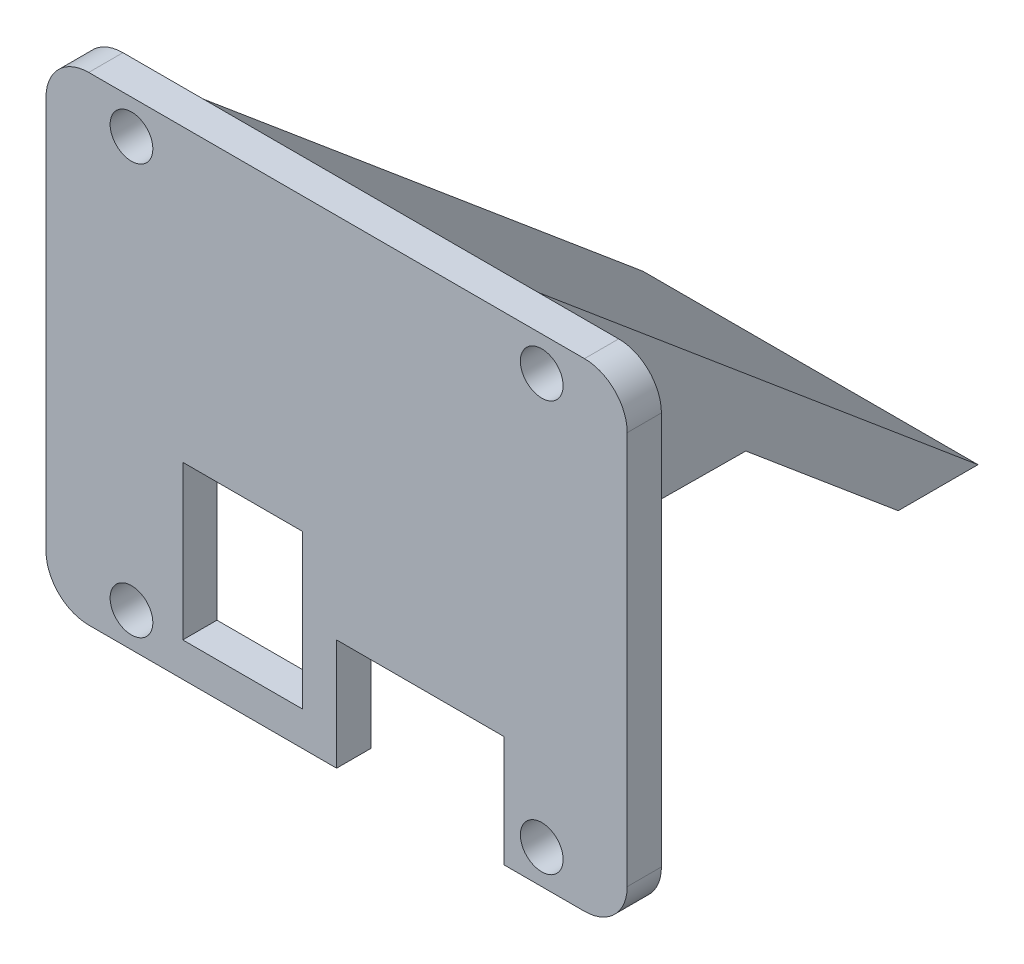
ISO-10303-21;
HEADER;
FILE_DESCRIPTION(('STEP AP214'),'2;1');
FILE_NAME('part.step','',(''),(''),'','','');
FILE_SCHEMA(('AUTOMOTIVE_DESIGN { 1 0 10303 214 1 1 1 1 }'));
ENDSEC;
DATA;
#1=APPLICATION_CONTEXT('core data for automotive mechanical design processes');
#2=APPLICATION_PROTOCOL_DEFINITION('international standard','automotive_design',2000,#1);
#3=PRODUCT_CONTEXT('',#1,'mechanical');
#4=PRODUCT('Part','Part','',(#3));
#5=PRODUCT_RELATED_PRODUCT_CATEGORY('part','',(#4));
#6=PRODUCT_DEFINITION_FORMATION('','',#4);
#7=PRODUCT_DEFINITION_CONTEXT('part definition',#1,'design');
#8=PRODUCT_DEFINITION('design','',#6,#7);
#9=PRODUCT_DEFINITION_SHAPE('','',#8);
#10=(LENGTH_UNIT() NAMED_UNIT(*) SI_UNIT(.MILLI.,.METRE.));
#11=(NAMED_UNIT(*) PLANE_ANGLE_UNIT() SI_UNIT($,.RADIAN.));
#12=(NAMED_UNIT(*) SI_UNIT($,.STERADIAN.) SOLID_ANGLE_UNIT());
#13=UNCERTAINTY_MEASURE_WITH_UNIT(LENGTH_MEASURE(1.E-05),#10,'distance_accuracy_value','');
#14=(GEOMETRIC_REPRESENTATION_CONTEXT(3) GLOBAL_UNCERTAINTY_ASSIGNED_CONTEXT((#13)) GLOBAL_UNIT_ASSIGNED_CONTEXT((#10,
#11,#12)) REPRESENTATION_CONTEXT('',''));
#15=CARTESIAN_POINT('',(0.,0.,0.));
#16=DIRECTION('',(0.,0.,1.));
#17=DIRECTION('',(1.,0.,0.));
#18=AXIS2_PLACEMENT_3D('',#15,#16,#17);
#19=CARTESIAN_POINT('',(9.8,-14.,0.));
#20=DIRECTION('',(1.,0.,0.));
#21=DIRECTION('',(0.,0.,-1.));
#22=AXIS2_PLACEMENT_3D('',#19,#20,#21);
#23=PLANE('',#22);
#24=DIRECTION('',(0.,-1.,0.));
#25=VECTOR('',#24,1.);
#26=CARTESIAN_POINT('',(9.8,-14.,2.));
#27=LINE('',#26,#25);
#28=CARTESIAN_POINT('',(9.8,-7.5,2.));
#29=VERTEX_POINT('',#28);
#30=CARTESIAN_POINT('',(9.8,-14.,2.));
#31=VERTEX_POINT('',#30);
#32=EDGE_CURVE('E283',#29,#31,#27,.T.);
#33=ORIENTED_EDGE('',*,*,#32,.F.);
#34=DIRECTION('',(0.,0.,1.));
#35=VECTOR('',#34,1.);
#36=CARTESIAN_POINT('',(9.8,-7.5,-8.5));
#37=LINE('',#36,#35);
#38=CARTESIAN_POINT('',(9.8,-7.5,0.));
#39=VERTEX_POINT('',#38);
#40=EDGE_CURVE('E324',#39,#29,#37,.T.);
#41=ORIENTED_EDGE('',*,*,#40,.F.);
#42=DIRECTION('',(0.,1.,0.));
#43=VECTOR('',#42,1.);
#44=CARTESIAN_POINT('',(9.8,-14.,0.));
#45=LINE('',#44,#43);
#46=CARTESIAN_POINT('',(9.8,-14.,0.));
#47=VERTEX_POINT('',#46);
#48=EDGE_CURVE('E402',#47,#39,#45,.T.);
#49=ORIENTED_EDGE('',*,*,#48,.F.);
#50=DIRECTION('',(0.,0.,1.));
#51=VECTOR('',#50,1.);
#52=CARTESIAN_POINT('',(9.8,-14.,0.));
#53=LINE('',#52,#51);
#54=EDGE_CURVE('E405',#47,#31,#53,.T.);
#55=ORIENTED_EDGE('',*,*,#54,.T.);
#56=EDGE_LOOP('',(#33,#41,#49,#55));
#57=FACE_BOUND('',#56,.T.);
#58=ADVANCED_FACE('F103',(#57),#23,.F.);
#59=CARTESIAN_POINT('',(0.,-14.,0.));
#60=DIRECTION('',(-1.,0.,0.));
#61=DIRECTION('',(0.,0.,1.));
#62=AXIS2_PLACEMENT_3D('',#59,#60,#61);
#63=PLANE('',#62);
#64=DIRECTION('',(0.,1.,0.));
#65=VECTOR('',#64,1.);
#66=CARTESIAN_POINT('',(0.,-14.,2.));
#67=LINE('',#66,#65);
#68=CARTESIAN_POINT('',(0.,-14.,2.));
#69=VERTEX_POINT('',#68);
#70=CARTESIAN_POINT('',(0.,-7.5,2.));
#71=VERTEX_POINT('',#70);
#72=EDGE_CURVE('E278',#69,#71,#67,.T.);
#73=ORIENTED_EDGE('',*,*,#72,.F.);
#74=DIRECTION('',(0.,0.,1.));
#75=VECTOR('',#74,1.);
#76=CARTESIAN_POINT('',(0.,-14.,0.));
#77=LINE('',#76,#75);
#78=CARTESIAN_POINT('',(0.,-14.,0.));
#79=VERTEX_POINT('',#78);
#80=EDGE_CURVE('E404',#79,#69,#77,.T.);
#81=ORIENTED_EDGE('',*,*,#80,.F.);
#82=DIRECTION('',(0.,-1.,0.));
#83=VECTOR('',#82,1.);
#84=CARTESIAN_POINT('',(0.,-14.,0.));
#85=LINE('',#84,#83);
#86=CARTESIAN_POINT('',(0.,-7.5,0.));
#87=VERTEX_POINT('',#86);
#88=EDGE_CURVE('E399',#87,#79,#85,.T.);
#89=ORIENTED_EDGE('',*,*,#88,.F.);
#90=DIRECTION('',(0.,0.,1.));
#91=VECTOR('',#90,1.);
#92=CARTESIAN_POINT('',(0.,-7.5,-8.5));
#93=LINE('',#92,#91);
#94=EDGE_CURVE('E325',#87,#71,#93,.T.);
#95=ORIENTED_EDGE('',*,*,#94,.T.);
#96=EDGE_LOOP('',(#73,#81,#89,#95));
#97=FACE_BOUND('',#96,.T.);
#98=ADVANCED_FACE('F472',(#97),#63,.F.);
#99=CARTESIAN_POINT('',(-17.,-14.,0.));
#100=DIRECTION('',(0.,-1.,0.));
#101=DIRECTION('',(0.,0.,-1.));
#102=AXIS2_PLACEMENT_3D('',#99,#100,#101);
#103=PLANE('',#102);
#104=ORIENTED_EDGE('',*,*,#80,.T.);
#105=DIRECTION('',(-1.,0.,0.));
#106=VECTOR('',#105,1.);
#107=CARTESIAN_POINT('',(-17.,-14.,2.));
#108=LINE('',#107,#106);
#109=CARTESIAN_POINT('',(-14.5,-14.,2.));
#110=VERTEX_POINT('',#109);
#111=EDGE_CURVE('E288',#69,#110,#108,.T.);
#112=ORIENTED_EDGE('',*,*,#111,.T.);
#113=DIRECTION('',(0.,0.,1.));
#114=VECTOR('',#113,1.);
#115=CARTESIAN_POINT('',(-14.5,-14.,0.));
#116=LINE('',#115,#114);
#117=CARTESIAN_POINT('',(-14.5,-14.,0.));
#118=VERTEX_POINT('',#117);
#119=EDGE_CURVE('E415',#110,#118,#116,.F.);
#120=ORIENTED_EDGE('',*,*,#119,.T.);
#121=DIRECTION('',(1.,0.,0.));
#122=VECTOR('',#121,1.);
#123=CARTESIAN_POINT('',(-17.,-14.,0.));
#124=LINE('',#123,#122);
#125=EDGE_CURVE('E397',#118,#79,#124,.T.);
#126=ORIENTED_EDGE('',*,*,#125,.T.);
#127=EDGE_LOOP('',(#104,#112,#120,#126));
#128=FACE_BOUND('',#127,.T.);
#129=ADVANCED_FACE('F474',(#128),#103,.T.);
#130=DIRECTION('',(0.,0.,1.));
#131=VECTOR('',#130,1.);
#132=CARTESIAN_POINT('',(14.5,-14.,0.));
#133=LINE('',#132,#131);
#134=CARTESIAN_POINT('',(14.5,-14.,0.));
#135=VERTEX_POINT('',#134);
#136=CARTESIAN_POINT('',(14.5,-14.,2.));
#137=VERTEX_POINT('',#136);
#138=EDGE_CURVE('E425',#135,#137,#133,.T.);
#139=ORIENTED_EDGE('',*,*,#138,.T.);
#140=DIRECTION('',(-1.,0.,0.));
#141=VECTOR('',#140,1.);
#142=CARTESIAN_POINT('',(-17.,-14.,2.));
#143=LINE('',#142,#141);
#144=EDGE_CURVE('E285',#137,#31,#143,.T.);
#145=ORIENTED_EDGE('',*,*,#144,.T.);
#146=ORIENTED_EDGE('',*,*,#54,.F.);
#147=EDGE_CURVE('E396',#47,#135,#124,.T.);
#148=ORIENTED_EDGE('',*,*,#147,.T.);
#149=EDGE_LOOP('',(#139,#145,#146,#148));
#150=FACE_BOUND('',#149,.T.);
#151=ADVANCED_FACE('F457',(#150),#103,.T.);
#152=CARTESIAN_POINT('',(-17.,14.,0.));
#153=DIRECTION('',(0.,1.,0.));
#154=DIRECTION('',(0.,0.,1.));
#155=AXIS2_PLACEMENT_3D('',#152,#153,#154);
#156=PLANE('',#155);
#157=DIRECTION('',(0.,0.,1.));
#158=VECTOR('',#157,1.);
#159=CARTESIAN_POINT('',(-14.5,14.,0.));
#160=LINE('',#159,#158);
#161=CARTESIAN_POINT('',(-14.5,14.,0.));
#162=VERTEX_POINT('',#161);
#163=CARTESIAN_POINT('',(-14.5,14.,2.));
#164=VERTEX_POINT('',#163);
#165=EDGE_CURVE('E433',#162,#164,#160,.T.);
#166=ORIENTED_EDGE('',*,*,#165,.T.);
#167=DIRECTION('',(1.,0.,0.));
#168=VECTOR('',#167,1.);
#169=CARTESIAN_POINT('',(-17.,14.,2.));
#170=LINE('',#169,#168);
#171=CARTESIAN_POINT('',(14.5,14.,2.));
#172=VERTEX_POINT('',#171);
#173=EDGE_CURVE('E309',#164,#172,#170,.T.);
#174=ORIENTED_EDGE('',*,*,#173,.T.);
#175=DIRECTION('',(0.,0.,1.));
#176=VECTOR('',#175,1.);
#177=CARTESIAN_POINT('',(14.5,14.,0.));
#178=LINE('',#177,#176);
#179=CARTESIAN_POINT('',(14.5,14.,0.));
#180=VERTEX_POINT('',#179);
#181=EDGE_CURVE('E111',#172,#180,#178,.F.);
#182=ORIENTED_EDGE('',*,*,#181,.T.);
#183=DIRECTION('',(-1.,0.,0.));
#184=VECTOR('',#183,1.);
#185=CARTESIAN_POINT('',(-17.,14.,0.));
#186=LINE('',#185,#184);
#187=CARTESIAN_POINT('',(9.8,14.,0.));
#188=VERTEX_POINT('',#187);
#189=EDGE_CURVE('E391',#180,#188,#186,.T.);
#190=ORIENTED_EDGE('',*,*,#189,.T.);
#191=DIRECTION('',(-1.,0.,0.));
#192=VECTOR('',#191,1.);
#193=CARTESIAN_POINT('',(9.8,14.,0.));
#194=LINE('',#193,#192);
#195=CARTESIAN_POINT('',(-9.8,14.,0.));
#196=VERTEX_POINT('',#195);
#197=EDGE_CURVE('E378',#188,#196,#194,.T.);
#198=ORIENTED_EDGE('',*,*,#197,.T.);
#199=DIRECTION('',(-1.,0.,0.));
#200=VECTOR('',#199,1.);
#201=CARTESIAN_POINT('',(-9.8,14.,0.));
#202=LINE('',#201,#200);
#203=EDGE_CURVE('E363',#196,#162,#202,.T.);
#204=ORIENTED_EDGE('',*,*,#203,.T.);
#205=EDGE_LOOP('',(#166,#174,#182,#190,#198,#204));
#206=FACE_BOUND('',#205,.T.);
#207=ADVANCED_FACE('F438',(#206),#156,.T.);
#208=CARTESIAN_POINT('',(17.,14.,0.));
#209=DIRECTION('',(1.,0.,0.));
#210=DIRECTION('',(0.,1.,0.));
#211=AXIS2_PLACEMENT_3D('',#208,#209,#210);
#212=PLANE('',#211);
#213=DIRECTION('',(0.,0.,1.));
#214=VECTOR('',#213,1.);
#215=CARTESIAN_POINT('',(17.,11.5,0.));
#216=LINE('',#215,#214);
#217=CARTESIAN_POINT('',(17.,11.5,0.));
#218=VERTEX_POINT('',#217);
#219=CARTESIAN_POINT('',(17.,11.5,2.));
#220=VERTEX_POINT('',#219);
#221=EDGE_CURVE('E428',#218,#220,#216,.T.);
#222=ORIENTED_EDGE('',*,*,#221,.T.);
#223=DIRECTION('',(0.,-1.,0.));
#224=VECTOR('',#223,1.);
#225=CARTESIAN_POINT('',(17.,14.,2.));
#226=LINE('',#225,#224);
#227=CARTESIAN_POINT('',(17.,-11.5,2.));
#228=VERTEX_POINT('',#227);
#229=EDGE_CURVE('E300',#220,#228,#226,.T.);
#230=ORIENTED_EDGE('',*,*,#229,.T.);
#231=DIRECTION('',(0.,0.,1.));
#232=VECTOR('',#231,1.);
#233=CARTESIAN_POINT('',(17.,-11.5,0.));
#234=LINE('',#233,#232);
#235=CARTESIAN_POINT('',(17.,-11.5,0.));
#236=VERTEX_POINT('',#235);
#237=EDGE_CURVE('E431',#228,#236,#234,.F.);
#238=ORIENTED_EDGE('',*,*,#237,.T.);
#239=DIRECTION('',(0.,1.,0.));
#240=VECTOR('',#239,1.);
#241=CARTESIAN_POINT('',(17.,14.,0.));
#242=LINE('',#241,#240);
#243=EDGE_CURVE('E381',#236,#218,#242,.T.);
#244=ORIENTED_EDGE('',*,*,#243,.T.);
#245=EDGE_LOOP('',(#222,#230,#238,#244));
#246=FACE_BOUND('',#245,.T.);
#247=ADVANCED_FACE('F448',(#246),#212,.T.);
#248=CARTESIAN_POINT('',(-17.,14.,0.));
#249=DIRECTION('',(-1.,0.,0.));
#250=DIRECTION('',(0.,0.,1.));
#251=AXIS2_PLACEMENT_3D('',#248,#249,#250);
#252=PLANE('',#251);
#253=DIRECTION('',(0.,0.,1.));
#254=VECTOR('',#253,1.);
#255=CARTESIAN_POINT('',(-17.,-11.5,0.));
#256=LINE('',#255,#254);
#257=CARTESIAN_POINT('',(-17.,-11.5,0.));
#258=VERTEX_POINT('',#257);
#259=CARTESIAN_POINT('',(-17.,-11.5,2.));
#260=VERTEX_POINT('',#259);
#261=EDGE_CURVE('E412',#258,#260,#256,.T.);
#262=ORIENTED_EDGE('',*,*,#261,.T.);
#263=DIRECTION('',(0.,1.,0.));
#264=VECTOR('',#263,1.);
#265=CARTESIAN_POINT('',(-17.,14.,2.));
#266=LINE('',#265,#264);
#267=CARTESIAN_POINT('',(-17.,11.5,2.));
#268=VERTEX_POINT('',#267);
#269=EDGE_CURVE('E297',#260,#268,#266,.T.);
#270=ORIENTED_EDGE('',*,*,#269,.T.);
#271=DIRECTION('',(0.,0.,1.));
#272=VECTOR('',#271,1.);
#273=CARTESIAN_POINT('',(-17.,11.5,0.));
#274=LINE('',#273,#272);
#275=CARTESIAN_POINT('',(-17.,11.5,0.));
#276=VERTEX_POINT('',#275);
#277=EDGE_CURVE('E408',#268,#276,#274,.F.);
#278=ORIENTED_EDGE('',*,*,#277,.T.);
#279=DIRECTION('',(0.,-1.,0.));
#280=VECTOR('',#279,1.);
#281=CARTESIAN_POINT('',(-17.,14.,0.));
#282=LINE('',#281,#280);
#283=EDGE_CURVE('E393',#276,#258,#282,.T.);
#284=ORIENTED_EDGE('',*,*,#283,.T.);
#285=EDGE_LOOP('',(#262,#270,#278,#284));
#286=FACE_BOUND('',#285,.T.);
#287=ADVANCED_FACE('F482',(#286),#252,.T.);
#288=CARTESIAN_POINT('',(-12.,12.,-7.));
#289=DIRECTION('',(0.,0.,1.));
#290=DIRECTION('',(1.,0.,0.));
#291=AXIS2_PLACEMENT_3D('',#288,#289,#290);
#292=CYLINDRICAL_SURFACE('',#291,1.25);
#293=CARTESIAN_POINT('',(-12.,12.,0.));
#294=DIRECTION('',(0.,0.,1.));
#295=DIRECTION('',(1.,0.,0.));
#296=AXIS2_PLACEMENT_3D('',#293,#294,#295);
#297=CIRCLE('',#296,1.25);
#298=CARTESIAN_POINT('',(-10.75,12.,0.));
#299=VERTEX_POINT('',#298);
#300=EDGE_CURVE('E333',#299,#299,#297,.T.);
#301=ORIENTED_EDGE('',*,*,#300,.F.);
#302=EDGE_LOOP('',(#301));
#303=FACE_BOUND('',#302,.T.);
#304=CARTESIAN_POINT('',(-12.,12.,2.));
#305=DIRECTION('',(0.,0.,1.));
#306=DIRECTION('',(1.,0.,0.));
#307=AXIS2_PLACEMENT_3D('',#304,#305,#306);
#308=CIRCLE('',#307,1.25);
#309=CARTESIAN_POINT('',(-10.75,12.,2.));
#310=VERTEX_POINT('',#309);
#311=EDGE_CURVE('E321',#310,#310,#308,.F.);
#312=ORIENTED_EDGE('',*,*,#311,.F.);
#313=EDGE_LOOP('',(#312));
#314=FACE_BOUND('',#313,.T.);
#315=ADVANCED_FACE('F551',(#303,#314),#292,.F.);
#316=CARTESIAN_POINT('',(12.,12.,-7.));
#317=DIRECTION('',(0.,0.,1.));
#318=DIRECTION('',(1.,0.,0.));
#319=AXIS2_PLACEMENT_3D('',#316,#317,#318);
#320=CYLINDRICAL_SURFACE('',#319,1.25);
#321=CARTESIAN_POINT('',(12.,12.,0.));
#322=DIRECTION('',(0.,0.,1.));
#323=DIRECTION('',(1.,0.,0.));
#324=AXIS2_PLACEMENT_3D('',#321,#322,#323);
#325=CIRCLE('',#324,1.25);
#326=CARTESIAN_POINT('',(13.25,12.,0.));
#327=VERTEX_POINT('',#326);
#328=EDGE_CURVE('E336',#327,#327,#325,.T.);
#329=ORIENTED_EDGE('',*,*,#328,.F.);
#330=EDGE_LOOP('',(#329));
#331=FACE_BOUND('',#330,.T.);
#332=CARTESIAN_POINT('',(12.,12.,2.));
#333=DIRECTION('',(0.,0.,1.));
#334=DIRECTION('',(1.,0.,0.));
#335=AXIS2_PLACEMENT_3D('',#332,#333,#334);
#336=CIRCLE('',#335,1.25);
#337=CARTESIAN_POINT('',(13.25,12.,2.));
#338=VERTEX_POINT('',#337);
#339=EDGE_CURVE('E318',#338,#338,#336,.F.);
#340=ORIENTED_EDGE('',*,*,#339,.F.);
#341=EDGE_LOOP('',(#340));
#342=FACE_BOUND('',#341,.T.);
#343=ADVANCED_FACE('F547',(#331,#342),#320,.F.);
#344=CARTESIAN_POINT('',(12.,-12.,-7.));
#345=DIRECTION('',(0.,0.,1.));
#346=DIRECTION('',(1.,0.,0.));
#347=AXIS2_PLACEMENT_3D('',#344,#345,#346);
#348=CYLINDRICAL_SURFACE('',#347,1.25);
#349=CARTESIAN_POINT('',(12.,-12.,0.));
#350=DIRECTION('',(0.,0.,1.));
#351=DIRECTION('',(1.,0.,0.));
#352=AXIS2_PLACEMENT_3D('',#349,#350,#351);
#353=CIRCLE('',#352,1.25);
#354=CARTESIAN_POINT('',(13.25,-12.,0.));
#355=VERTEX_POINT('',#354);
#356=EDGE_CURVE('E339',#355,#355,#353,.T.);
#357=ORIENTED_EDGE('',*,*,#356,.F.);
#358=EDGE_LOOP('',(#357));
#359=FACE_BOUND('',#358,.T.);
#360=CARTESIAN_POINT('',(12.,-12.,2.));
#361=DIRECTION('',(0.,0.,1.));
#362=DIRECTION('',(1.,0.,0.));
#363=AXIS2_PLACEMENT_3D('',#360,#361,#362);
#364=CIRCLE('',#363,1.25);
#365=CARTESIAN_POINT('',(13.25,-12.,2.));
#366=VERTEX_POINT('',#365);
#367=EDGE_CURVE('E315',#366,#366,#364,.F.);
#368=ORIENTED_EDGE('',*,*,#367,.F.);
#369=EDGE_LOOP('',(#368));
#370=FACE_BOUND('',#369,.T.);
#371=ADVANCED_FACE('F550',(#359,#370),#348,.F.);
#372=CARTESIAN_POINT('',(-12.,-12.,-7.));
#373=DIRECTION('',(0.,0.,1.));
#374=DIRECTION('',(1.,0.,0.));
#375=AXIS2_PLACEMENT_3D('',#372,#373,#374);
#376=CYLINDRICAL_SURFACE('',#375,1.25);
#377=CARTESIAN_POINT('',(-12.,-12.,0.));
#378=DIRECTION('',(0.,0.,1.));
#379=DIRECTION('',(1.,0.,0.));
#380=AXIS2_PLACEMENT_3D('',#377,#378,#379);
#381=CIRCLE('',#380,1.25);
#382=CARTESIAN_POINT('',(-10.75,-12.,0.));
#383=VERTEX_POINT('',#382);
#384=EDGE_CURVE('E342',#383,#383,#381,.T.);
#385=ORIENTED_EDGE('',*,*,#384,.F.);
#386=EDGE_LOOP('',(#385));
#387=FACE_BOUND('',#386,.T.);
#388=CARTESIAN_POINT('',(-12.,-12.,2.));
#389=DIRECTION('',(0.,0.,1.));
#390=DIRECTION('',(1.,0.,0.));
#391=AXIS2_PLACEMENT_3D('',#388,#389,#390);
#392=CIRCLE('',#391,1.25);
#393=CARTESIAN_POINT('',(-10.75,-12.,2.));
#394=VERTEX_POINT('',#393);
#395=EDGE_CURVE('E312',#394,#394,#392,.F.);
#396=ORIENTED_EDGE('',*,*,#395,.F.);
#397=EDGE_LOOP('',(#396));
#398=FACE_BOUND('',#397,.T.);
#399=ADVANCED_FACE('F530',(#387,#398),#376,.F.);
#400=CARTESIAN_POINT('',(-14.5,-11.5,0.));
#401=DIRECTION('',(0.,0.,1.));
#402=DIRECTION('',(1.,0.,0.));
#403=AXIS2_PLACEMENT_3D('',#400,#401,#402);
#404=CYLINDRICAL_SURFACE('',#403,2.5);
#405=ORIENTED_EDGE('',*,*,#119,.F.);
#406=CARTESIAN_POINT('',(-14.5,-11.5,2.));
#407=DIRECTION('',(0.,0.,1.));
#408=DIRECTION('',(1.,0.,0.));
#409=AXIS2_PLACEMENT_3D('',#406,#407,#408);
#410=CIRCLE('',#409,2.5);
#411=EDGE_CURVE('E294',#110,#260,#410,.F.);
#412=ORIENTED_EDGE('',*,*,#411,.T.);
#413=ORIENTED_EDGE('',*,*,#261,.F.);
#414=CARTESIAN_POINT('',(-14.5,-11.5,0.));
#415=DIRECTION('',(0.,0.,1.));
#416=DIRECTION('',(1.,0.,0.));
#417=AXIS2_PLACEMENT_3D('',#414,#415,#416);
#418=CIRCLE('',#417,2.5);
#419=EDGE_CURVE('E423',#118,#258,#418,.F.);
#420=ORIENTED_EDGE('',*,*,#419,.F.);
#421=EDGE_LOOP('',(#405,#412,#413,#420));
#422=FACE_BOUND('',#421,.T.);
#423=ADVANCED_FACE('F477',(#422),#404,.T.);
#424=CARTESIAN_POINT('',(14.5,-11.5,0.));
#425=DIRECTION('',(0.,0.,1.));
#426=DIRECTION('',(1.,0.,0.));
#427=AXIS2_PLACEMENT_3D('',#424,#425,#426);
#428=CYLINDRICAL_SURFACE('',#427,2.5);
#429=ORIENTED_EDGE('',*,*,#237,.F.);
#430=CARTESIAN_POINT('',(14.5,-11.5,2.));
#431=DIRECTION('',(0.,0.,1.));
#432=DIRECTION('',(1.,0.,0.));
#433=AXIS2_PLACEMENT_3D('',#430,#431,#432);
#434=CIRCLE('',#433,2.5);
#435=EDGE_CURVE('E291',#228,#137,#434,.F.);
#436=ORIENTED_EDGE('',*,*,#435,.T.);
#437=ORIENTED_EDGE('',*,*,#138,.F.);
#438=CARTESIAN_POINT('',(14.5,-11.5,0.));
#439=DIRECTION('',(0.,0.,1.));
#440=DIRECTION('',(1.,0.,0.));
#441=AXIS2_PLACEMENT_3D('',#438,#439,#440);
#442=CIRCLE('',#441,2.5);
#443=EDGE_CURVE('E421',#236,#135,#442,.F.);
#444=ORIENTED_EDGE('',*,*,#443,.F.);
#445=EDGE_LOOP('',(#429,#436,#437,#444));
#446=FACE_BOUND('',#445,.T.);
#447=ADVANCED_FACE('F455',(#446),#428,.T.);
#448=CARTESIAN_POINT('',(14.5,11.5,0.));
#449=DIRECTION('',(0.,0.,1.));
#450=DIRECTION('',(1.,0.,0.));
#451=AXIS2_PLACEMENT_3D('',#448,#449,#450);
#452=CYLINDRICAL_SURFACE('',#451,2.5);
#453=ORIENTED_EDGE('',*,*,#181,.F.);
#454=CARTESIAN_POINT('',(14.5,11.5,2.));
#455=DIRECTION('',(0.,0.,1.));
#456=DIRECTION('',(1.,0.,0.));
#457=AXIS2_PLACEMENT_3D('',#454,#455,#456);
#458=CIRCLE('',#457,2.5);
#459=EDGE_CURVE('E306',#172,#220,#458,.F.);
#460=ORIENTED_EDGE('',*,*,#459,.T.);
#461=ORIENTED_EDGE('',*,*,#221,.F.);
#462=CARTESIAN_POINT('',(14.5,11.5,0.));
#463=DIRECTION('',(0.,0.,1.));
#464=DIRECTION('',(1.,0.,0.));
#465=AXIS2_PLACEMENT_3D('',#462,#463,#464);
#466=CIRCLE('',#465,2.5);
#467=EDGE_CURVE('E419',#180,#218,#466,.F.);
#468=ORIENTED_EDGE('',*,*,#467,.F.);
#469=EDGE_LOOP('',(#453,#460,#461,#468));
#470=FACE_BOUND('',#469,.T.);
#471=ADVANCED_FACE('F446',(#470),#452,.T.);
#472=CARTESIAN_POINT('',(-14.5,11.5,0.));
#473=DIRECTION('',(0.,0.,1.));
#474=DIRECTION('',(1.,0.,0.));
#475=AXIS2_PLACEMENT_3D('',#472,#473,#474);
#476=CYLINDRICAL_SURFACE('',#475,2.5);
#477=ORIENTED_EDGE('',*,*,#277,.F.);
#478=CARTESIAN_POINT('',(-14.5,11.5,2.));
#479=DIRECTION('',(0.,0.,1.));
#480=DIRECTION('',(1.,0.,0.));
#481=AXIS2_PLACEMENT_3D('',#478,#479,#480);
#482=CIRCLE('',#481,2.5);
#483=EDGE_CURVE('E303',#268,#164,#482,.F.);
#484=ORIENTED_EDGE('',*,*,#483,.T.);
#485=ORIENTED_EDGE('',*,*,#165,.F.);
#486=CARTESIAN_POINT('',(-14.5,11.5,0.));
#487=DIRECTION('',(0.,0.,1.));
#488=DIRECTION('',(1.,0.,0.));
#489=AXIS2_PLACEMENT_3D('',#486,#487,#488);
#490=CIRCLE('',#489,2.5);
#491=EDGE_CURVE('E417',#276,#162,#490,.F.);
#492=ORIENTED_EDGE('',*,*,#491,.F.);
#493=EDGE_LOOP('',(#477,#484,#485,#492));
#494=FACE_BOUND('',#493,.T.);
#495=ADVANCED_FACE('F105',(#494),#476,.T.);
#496=CARTESIAN_POINT('',(0.,-7.5,-8.5));
#497=DIRECTION('',(0.,1.,0.));
#498=DIRECTION('',(0.,0.,1.));
#499=AXIS2_PLACEMENT_3D('',#496,#497,#498);
#500=PLANE('',#499);
#501=DIRECTION('',(1.,0.,0.));
#502=VECTOR('',#501,1.);
#503=CARTESIAN_POINT('',(0.,-7.5,2.));
#504=LINE('',#503,#502);
#505=EDGE_CURVE('E12',#71,#29,#504,.T.);
#506=ORIENTED_EDGE('',*,*,#505,.F.);
#507=ORIENTED_EDGE('',*,*,#94,.F.);
#508=DIRECTION('',(-1.,0.,0.));
#509=VECTOR('',#508,1.);
#510=CARTESIAN_POINT('',(0.,-7.5,0.));
#511=LINE('',#510,#509);
#512=EDGE_CURVE('E328',#39,#87,#511,.T.);
#513=ORIENTED_EDGE('',*,*,#512,.F.);
#514=ORIENTED_EDGE('',*,*,#40,.T.);
#515=EDGE_LOOP('',(#506,#507,#513,#514));
#516=FACE_BOUND('',#515,.T.);
#517=ADVANCED_FACE('F465',(#516),#500,.F.);
#518=CARTESIAN_POINT('',(9.8,5.91740391431151,-4.96529144202584));
#519=DIRECTION('',(0.,-0.766044443118975,0.642787609686544));
#520=DIRECTION('',(0.,-0.642787609686544,-0.766044443118975));
#521=AXIS2_PLACEMENT_3D('',#518,#519,#520);
#522=PLANE('',#521);
#523=DIRECTION('',(-1.,0.,0.));
#524=VECTOR('',#523,1.);
#525=CARTESIAN_POINT('',(9.8,-0.100790084884902,-12.137495761497));
#526=LINE('',#525,#524);
#527=CARTESIAN_POINT('',(9.8,-0.100790084884902,-12.137495761497));
#528=VERTEX_POINT('',#527);
#529=CARTESIAN_POINT('',(-9.8,-0.100790084884902,-12.137495761497));
#530=VERTEX_POINT('',#529);
#531=EDGE_CURVE('E385',#528,#530,#526,.T.);
#532=ORIENTED_EDGE('',*,*,#531,.T.);
#533=DIRECTION('',(0.,0.642787609686544,0.766044443118974));
#534=VECTOR('',#533,1.);
#535=CARTESIAN_POINT('',(-9.8,-7.58176161995323,-21.0529704645096));
#536=LINE('',#535,#534);
#537=CARTESIAN_POINT('',(-9.8,-7.58176161995323,-21.0529704645096));
#538=VERTEX_POINT('',#537);
#539=EDGE_CURVE('E352',#538,#530,#536,.T.);
#540=ORIENTED_EDGE('',*,*,#539,.F.);
#541=DIRECTION('',(-1.,0.,0.));
#542=VECTOR('',#541,1.);
#543=CARTESIAN_POINT('',(9.8,-7.58176161995323,-21.0529704645096));
#544=LINE('',#543,#542);
#545=CARTESIAN_POINT('',(9.8,-7.58176161995323,-21.0529704645096));
#546=VERTEX_POINT('',#545);
#547=EDGE_CURVE('E377',#546,#538,#544,.T.);
#548=ORIENTED_EDGE('',*,*,#547,.F.);
#549=DIRECTION('',(0.,0.642787609686544,0.766044443118974));
#550=VECTOR('',#549,1.);
#551=CARTESIAN_POINT('',(9.8,5.91740391431151,-4.96529144202584));
#552=LINE('',#551,#550);
#553=EDGE_CURVE('E366',#546,#528,#552,.T.);
#554=ORIENTED_EDGE('',*,*,#553,.T.);
#555=EDGE_LOOP('',(#532,#540,#548,#554));
#556=FACE_BOUND('',#555,.T.);
#557=ADVANCED_FACE('F501',(#556),#522,.T.);
#558=CARTESIAN_POINT('',(9.8,0.,0.));
#559=DIRECTION('',(0.,0.999965523356053,-0.00830374007633032));
#560=DIRECTION('',(0.,0.00830374007633032,0.999965523356053));
#561=AXIS2_PLACEMENT_3D('',#558,#559,#560);
#562=PLANE('',#561);
#563=DIRECTION('',(0.,0.00830374007633033,0.999965523356053));
#564=VECTOR('',#563,1.);
#565=CARTESIAN_POINT('',(-9.8,-0.100790084884902,-12.137495761497));
#566=LINE('',#565,#564);
#567=CARTESIAN_POINT('',(-9.8,0.,0.));
#568=VERTEX_POINT('',#567);
#569=EDGE_CURVE('E354',#530,#568,#566,.T.);
#570=ORIENTED_EDGE('',*,*,#569,.F.);
#571=ORIENTED_EDGE('',*,*,#531,.F.);
#572=DIRECTION('',(0.,-0.00830374007633032,-0.999965523356053));
#573=VECTOR('',#572,1.);
#574=CARTESIAN_POINT('',(9.8,0.,0.));
#575=LINE('',#574,#573);
#576=CARTESIAN_POINT('',(9.8,0.,0.));
#577=VERTEX_POINT('',#576);
#578=EDGE_CURVE('E369',#577,#528,#575,.T.);
#579=ORIENTED_EDGE('',*,*,#578,.F.);
#580=DIRECTION('',(-1.,0.,0.));
#581=VECTOR('',#580,1.);
#582=CARTESIAN_POINT('',(9.8,0.,0.));
#583=LINE('',#582,#581);
#584=EDGE_CURVE('E382',#577,#568,#583,.T.);
#585=ORIENTED_EDGE('',*,*,#584,.T.);
#586=EDGE_LOOP('',(#570,#571,#579,#585));
#587=FACE_BOUND('',#586,.T.);
#588=ADVANCED_FACE('F507',(#587),#562,.F.);
#589=CARTESIAN_POINT('',(9.8,8.21553724366844,-6.89365427108548));
#590=DIRECTION('',(0.,0.766044443118974,-0.642787609686544));
#591=DIRECTION('',(0.,0.642787609686544,0.766044443118974));
#592=AXIS2_PLACEMENT_3D('',#589,#590,#591);
#593=PLANE('',#592);
#594=DIRECTION('',(1.,0.,0.));
#595=VECTOR('',#594,1.);
#596=CARTESIAN_POINT('',(9.8,-7.58176161995323,-25.7201419450908));
#597=LINE('',#596,#595);
#598=CARTESIAN_POINT('',(-9.8,-7.58176161995323,-25.7201419450908));
#599=VERTEX_POINT('',#598);
#600=CARTESIAN_POINT('',(9.8,-7.58176161995323,-25.7201419450908));
#601=VERTEX_POINT('',#600);
#602=EDGE_CURVE('E350',#599,#601,#597,.T.);
#603=ORIENTED_EDGE('',*,*,#602,.F.);
#604=DIRECTION('',(0.,-0.642787609686544,-0.766044443118974));
#605=VECTOR('',#604,1.);
#606=CARTESIAN_POINT('',(-9.8,14.,0.));
#607=LINE('',#606,#605);
#608=EDGE_CURVE('E360',#196,#599,#607,.T.);
#609=ORIENTED_EDGE('',*,*,#608,.F.);
#610=ORIENTED_EDGE('',*,*,#197,.F.);
#611=DIRECTION('',(0.,-0.642787609686544,-0.766044443118974));
#612=VECTOR('',#611,1.);
#613=CARTESIAN_POINT('',(9.8,8.21553724366844,-6.89365427108548));
#614=LINE('',#613,#612);
#615=EDGE_CURVE('E374',#188,#601,#614,.T.);
#616=ORIENTED_EDGE('',*,*,#615,.T.);
#617=EDGE_LOOP('',(#603,#609,#610,#616));
#618=FACE_BOUND('',#617,.T.);
#619=ADVANCED_FACE('F490',(#618),#593,.T.);
#620=CARTESIAN_POINT('',(0.,0.,0.));
#621=DIRECTION('',(0.,0.,1.));
#622=DIRECTION('',(1.,0.,0.));
#623=AXIS2_PLACEMENT_3D('',#620,#621,#622);
#624=PLANE('',#623);
#625=DIRECTION('',(-1.,0.,0.));
#626=VECTOR('',#625,1.);
#627=CARTESIAN_POINT('',(-2.,-3.,0.));
#628=LINE('',#627,#626);
#629=CARTESIAN_POINT('',(-2.,-3.,0.));
#630=VERTEX_POINT('',#629);
#631=CARTESIAN_POINT('',(-9.,-3.,0.));
#632=VERTEX_POINT('',#631);
#633=EDGE_CURVE('E253',#630,#632,#628,.T.);
#634=ORIENTED_EDGE('',*,*,#633,.T.);
#635=DIRECTION('',(0.,-1.,0.));
#636=VECTOR('',#635,1.);
#637=CARTESIAN_POINT('',(-9.,-12.,0.));
#638=LINE('',#637,#636);
#639=CARTESIAN_POINT('',(-9.,-12.,0.));
#640=VERTEX_POINT('',#639);
#641=EDGE_CURVE('E247',#632,#640,#638,.T.);
#642=ORIENTED_EDGE('',*,*,#641,.T.);
#643=DIRECTION('',(1.,0.,0.));
#644=VECTOR('',#643,1.);
#645=CARTESIAN_POINT('',(-2.,-12.,0.));
#646=LINE('',#645,#644);
#647=CARTESIAN_POINT('',(-2.,-12.,0.));
#648=VERTEX_POINT('',#647);
#649=EDGE_CURVE('E256',#640,#648,#646,.T.);
#650=ORIENTED_EDGE('',*,*,#649,.T.);
#651=DIRECTION('',(0.,1.,0.));
#652=VECTOR('',#651,1.);
#653=CARTESIAN_POINT('',(-2.,-12.,0.));
#654=LINE('',#653,#652);
#655=EDGE_CURVE('E118',#648,#630,#654,.T.);
#656=ORIENTED_EDGE('',*,*,#655,.T.);
#657=EDGE_LOOP('',(#634,#642,#650,#656));
#658=FACE_BOUND('',#657,.T.);
#659=ORIENTED_EDGE('',*,*,#384,.T.);
#660=EDGE_LOOP('',(#659));
#661=FACE_BOUND('',#660,.T.);
#662=ORIENTED_EDGE('',*,*,#356,.T.);
#663=EDGE_LOOP('',(#662));
#664=FACE_BOUND('',#663,.T.);
#665=ORIENTED_EDGE('',*,*,#328,.T.);
#666=EDGE_LOOP('',(#665));
#667=FACE_BOUND('',#666,.T.);
#668=ORIENTED_EDGE('',*,*,#300,.T.);
#669=EDGE_LOOP('',(#668));
#670=FACE_BOUND('',#669,.T.);
#671=ORIENTED_EDGE('',*,*,#512,.T.);
#672=ORIENTED_EDGE('',*,*,#88,.T.);
#673=ORIENTED_EDGE('',*,*,#125,.F.);
#674=ORIENTED_EDGE('',*,*,#419,.T.);
#675=ORIENTED_EDGE('',*,*,#283,.F.);
#676=ORIENTED_EDGE('',*,*,#491,.T.);
#677=ORIENTED_EDGE('',*,*,#203,.F.);
#678=DIRECTION('',(0.,1.,0.));
#679=VECTOR('',#678,1.);
#680=CARTESIAN_POINT('',(-9.8,0.,0.));
#681=LINE('',#680,#679);
#682=EDGE_CURVE('E357',#568,#196,#681,.T.);
#683=ORIENTED_EDGE('',*,*,#682,.F.);
#684=ORIENTED_EDGE('',*,*,#584,.F.);
#685=DIRECTION('',(0.,-1.,0.));
#686=VECTOR('',#685,1.);
#687=CARTESIAN_POINT('',(9.8,0.,0.));
#688=LINE('',#687,#686);
#689=EDGE_CURVE('E371',#188,#577,#688,.T.);
#690=ORIENTED_EDGE('',*,*,#689,.F.);
#691=ORIENTED_EDGE('',*,*,#189,.F.);
#692=ORIENTED_EDGE('',*,*,#467,.T.);
#693=ORIENTED_EDGE('',*,*,#243,.F.);
#694=ORIENTED_EDGE('',*,*,#443,.T.);
#695=ORIENTED_EDGE('',*,*,#147,.F.);
#696=ORIENTED_EDGE('',*,*,#48,.T.);
#697=EDGE_LOOP('',(#671,#672,#673,#674,#675,#676,#677,#683,#684,#690,#691,#692,#693,#694,#695,#696));
#698=FACE_BOUND('',#697,.T.);
#699=ADVANCED_FACE('F260',(#658,#661,#664,#667,#670,#698),#624,.F.);
#700=CARTESIAN_POINT('',(9.8,0.,0.));
#701=DIRECTION('',(-1.,0.,0.));
#702=DIRECTION('',(0.,0.,1.));
#703=AXIS2_PLACEMENT_3D('',#700,#701,#702);
#704=PLANE('',#703);
#705=ORIENTED_EDGE('',*,*,#553,.F.);
#706=DIRECTION('',(0.,0.,-1.));
#707=VECTOR('',#706,1.);
#708=CARTESIAN_POINT('',(9.8,-7.58176161995323,0.));
#709=LINE('',#708,#707);
#710=EDGE_CURVE('E347',#546,#601,#709,.T.);
#711=ORIENTED_EDGE('',*,*,#710,.T.);
#712=ORIENTED_EDGE('',*,*,#615,.F.);
#713=ORIENTED_EDGE('',*,*,#689,.T.);
#714=ORIENTED_EDGE('',*,*,#578,.T.);
#715=EDGE_LOOP('',(#705,#711,#712,#713,#714));
#716=FACE_BOUND('',#715,.T.);
#717=ADVANCED_FACE('F493',(#716),#704,.F.);
#718=CARTESIAN_POINT('',(-9.8,0.,0.));
#719=DIRECTION('',(-1.,0.,0.));
#720=DIRECTION('',(0.,0.,1.));
#721=AXIS2_PLACEMENT_3D('',#718,#719,#720);
#722=PLANE('',#721);
#723=DIRECTION('',(0.,0.,-1.));
#724=VECTOR('',#723,1.);
#725=CARTESIAN_POINT('',(-9.8,-7.58176161995323,-21.0529704645096));
#726=LINE('',#725,#724);
#727=EDGE_CURVE('E345',#538,#599,#726,.T.);
#728=ORIENTED_EDGE('',*,*,#727,.F.);
#729=ORIENTED_EDGE('',*,*,#539,.T.);
#730=ORIENTED_EDGE('',*,*,#569,.T.);
#731=ORIENTED_EDGE('',*,*,#682,.T.);
#732=ORIENTED_EDGE('',*,*,#608,.T.);
#733=EDGE_LOOP('',(#728,#729,#730,#731,#732));
#734=FACE_BOUND('',#733,.T.);
#735=ADVANCED_FACE('F505',(#734),#722,.T.);
#736=CARTESIAN_POINT('',(10.2,-7.58176161995323,-21.0529704645096));
#737=DIRECTION('',(0.,1.,0.));
#738=DIRECTION('',(0.,0.,1.));
#739=AXIS2_PLACEMENT_3D('',#736,#737,#738);
#740=PLANE('',#739);
#741=ORIENTED_EDGE('',*,*,#602,.T.);
#742=ORIENTED_EDGE('',*,*,#710,.F.);
#743=ORIENTED_EDGE('',*,*,#547,.T.);
#744=ORIENTED_EDGE('',*,*,#727,.T.);
#745=EDGE_LOOP('',(#741,#742,#743,#744));
#746=FACE_BOUND('',#745,.T.);
#747=ADVANCED_FACE('F497',(#746),#740,.F.);
#748=CARTESIAN_POINT('',(0.,0.,2.));
#749=DIRECTION('',(0.,0.,1.));
#750=DIRECTION('',(1.,0.,0.));
#751=AXIS2_PLACEMENT_3D('',#748,#749,#750);
#752=PLANE('',#751);
#753=DIRECTION('',(0.,-1.,0.));
#754=VECTOR('',#753,1.);
#755=CARTESIAN_POINT('',(-9.,-12.,2.));
#756=LINE('',#755,#754);
#757=CARTESIAN_POINT('',(-9.,-3.,2.));
#758=VERTEX_POINT('',#757);
#759=CARTESIAN_POINT('',(-9.,-12.,2.));
#760=VERTEX_POINT('',#759);
#761=EDGE_CURVE('E126',#758,#760,#756,.T.);
#762=ORIENTED_EDGE('',*,*,#761,.F.);
#763=DIRECTION('',(-1.,0.,0.));
#764=VECTOR('',#763,1.);
#765=CARTESIAN_POINT('',(-2.,-3.,2.));
#766=LINE('',#765,#764);
#767=CARTESIAN_POINT('',(-2.,-3.,2.));
#768=VERTEX_POINT('',#767);
#769=EDGE_CURVE('E263',#768,#758,#766,.T.);
#770=ORIENTED_EDGE('',*,*,#769,.F.);
#771=DIRECTION('',(0.,1.,0.));
#772=VECTOR('',#771,1.);
#773=CARTESIAN_POINT('',(-2.,-12.,2.));
#774=LINE('',#773,#772);
#775=CARTESIAN_POINT('',(-2.,-12.,2.));
#776=VERTEX_POINT('',#775);
#777=EDGE_CURVE('E266',#776,#768,#774,.T.);
#778=ORIENTED_EDGE('',*,*,#777,.F.);
#779=DIRECTION('',(1.,0.,0.));
#780=VECTOR('',#779,1.);
#781=CARTESIAN_POINT('',(-2.,-12.,2.));
#782=LINE('',#781,#780);
#783=EDGE_CURVE('E272',#760,#776,#782,.T.);
#784=ORIENTED_EDGE('',*,*,#783,.F.);
#785=EDGE_LOOP('',(#762,#770,#778,#784));
#786=FACE_BOUND('',#785,.T.);
#787=ORIENTED_EDGE('',*,*,#483,.F.);
#788=ORIENTED_EDGE('',*,*,#269,.F.);
#789=ORIENTED_EDGE('',*,*,#411,.F.);
#790=ORIENTED_EDGE('',*,*,#111,.F.);
#791=ORIENTED_EDGE('',*,*,#72,.T.);
#792=ORIENTED_EDGE('',*,*,#505,.T.);
#793=ORIENTED_EDGE('',*,*,#32,.T.);
#794=ORIENTED_EDGE('',*,*,#144,.F.);
#795=ORIENTED_EDGE('',*,*,#435,.F.);
#796=ORIENTED_EDGE('',*,*,#229,.F.);
#797=ORIENTED_EDGE('',*,*,#459,.F.);
#798=ORIENTED_EDGE('',*,*,#173,.F.);
#799=EDGE_LOOP('',(#787,#788,#789,#790,#791,#792,#793,#794,#795,#796,#797,#798));
#800=FACE_BOUND('',#799,.T.);
#801=ORIENTED_EDGE('',*,*,#395,.T.);
#802=EDGE_LOOP('',(#801));
#803=FACE_BOUND('',#802,.T.);
#804=ORIENTED_EDGE('',*,*,#367,.T.);
#805=EDGE_LOOP('',(#804));
#806=FACE_BOUND('',#805,.T.);
#807=ORIENTED_EDGE('',*,*,#339,.T.);
#808=EDGE_LOOP('',(#807));
#809=FACE_BOUND('',#808,.T.);
#810=ORIENTED_EDGE('',*,*,#311,.T.);
#811=EDGE_LOOP('',(#810));
#812=FACE_BOUND('',#811,.T.);
#813=ADVANCED_FACE('F545',(#786,#800,#803,#806,#809,#812),#752,.T.);
#814=CARTESIAN_POINT('',(-9.,-12.,0.));
#815=DIRECTION('',(-1.,0.,0.));
#816=DIRECTION('',(0.,0.,1.));
#817=AXIS2_PLACEMENT_3D('',#814,#815,#816);
#818=PLANE('',#817);
#819=ORIENTED_EDGE('',*,*,#761,.T.);
#820=DIRECTION('',(0.,0.,1.));
#821=VECTOR('',#820,1.);
#822=CARTESIAN_POINT('',(-9.,-12.,0.));
#823=LINE('',#822,#821);
#824=EDGE_CURVE('E243',#640,#760,#823,.T.);
#825=ORIENTED_EDGE('',*,*,#824,.F.);
#826=ORIENTED_EDGE('',*,*,#641,.F.);
#827=DIRECTION('',(0.,0.,1.));
#828=VECTOR('',#827,1.);
#829=CARTESIAN_POINT('',(-9.,-3.,0.));
#830=LINE('',#829,#828);
#831=EDGE_CURVE('E276',#632,#758,#830,.T.);
#832=ORIENTED_EDGE('',*,*,#831,.T.);
#833=EDGE_LOOP('',(#819,#825,#826,#832));
#834=FACE_BOUND('',#833,.T.);
#835=ADVANCED_FACE('F245',(#834),#818,.F.);
#836=CARTESIAN_POINT('',(-2.,-3.,0.));
#837=DIRECTION('',(0.,1.,0.));
#838=DIRECTION('',(-1.,0.,0.));
#839=AXIS2_PLACEMENT_3D('',#836,#837,#838);
#840=PLANE('',#839);
#841=ORIENTED_EDGE('',*,*,#769,.T.);
#842=ORIENTED_EDGE('',*,*,#831,.F.);
#843=ORIENTED_EDGE('',*,*,#633,.F.);
#844=DIRECTION('',(0.,0.,1.));
#845=VECTOR('',#844,1.);
#846=CARTESIAN_POINT('',(-2.,-3.,0.));
#847=LINE('',#846,#845);
#848=EDGE_CURVE('E279',#630,#768,#847,.T.);
#849=ORIENTED_EDGE('',*,*,#848,.T.);
#850=EDGE_LOOP('',(#841,#842,#843,#849));
#851=FACE_BOUND('',#850,.T.);
#852=ADVANCED_FACE('F688',(#851),#840,.F.);
#853=CARTESIAN_POINT('',(-2.,-12.,0.));
#854=DIRECTION('',(1.,0.,0.));
#855=DIRECTION('',(0.,0.,-1.));
#856=AXIS2_PLACEMENT_3D('',#853,#854,#855);
#857=PLANE('',#856);
#858=ORIENTED_EDGE('',*,*,#777,.T.);
#859=ORIENTED_EDGE('',*,*,#848,.F.);
#860=ORIENTED_EDGE('',*,*,#655,.F.);
#861=DIRECTION('',(0.,0.,1.));
#862=VECTOR('',#861,1.);
#863=CARTESIAN_POINT('',(-2.,-12.,0.));
#864=LINE('',#863,#862);
#865=EDGE_CURVE('E252',#648,#776,#864,.T.);
#866=ORIENTED_EDGE('',*,*,#865,.T.);
#867=EDGE_LOOP('',(#858,#859,#860,#866));
#868=FACE_BOUND('',#867,.T.);
#869=ADVANCED_FACE('F696',(#868),#857,.F.);
#870=CARTESIAN_POINT('',(-2.,-12.,0.));
#871=DIRECTION('',(0.,-1.,0.));
#872=DIRECTION('',(1.,0.,0.));
#873=AXIS2_PLACEMENT_3D('',#870,#871,#872);
#874=PLANE('',#873);
#875=ORIENTED_EDGE('',*,*,#783,.T.);
#876=ORIENTED_EDGE('',*,*,#865,.F.);
#877=ORIENTED_EDGE('',*,*,#649,.F.);
#878=ORIENTED_EDGE('',*,*,#824,.T.);
#879=EDGE_LOOP('',(#875,#876,#877,#878));
#880=FACE_BOUND('',#879,.T.);
#881=ADVANCED_FACE('F257',(#880),#874,.F.);
#882=CLOSED_SHELL('',(#58,#98,#129,#151,#207,#247,#287,#315,#343,#371,#399,#423,#447,#471,#495,
#517,#557,#588,#619,#699,#717,#735,#747,#813,#835,#852,#869,#881));
#883=MANIFOLD_SOLID_BREP('B2',#882);
#884=ADVANCED_BREP_SHAPE_REPRESENTATION('',(#18,#883),#14);
#885=SHAPE_DEFINITION_REPRESENTATION(#9,#884);
ENDSEC;
END-ISO-10303-21;
